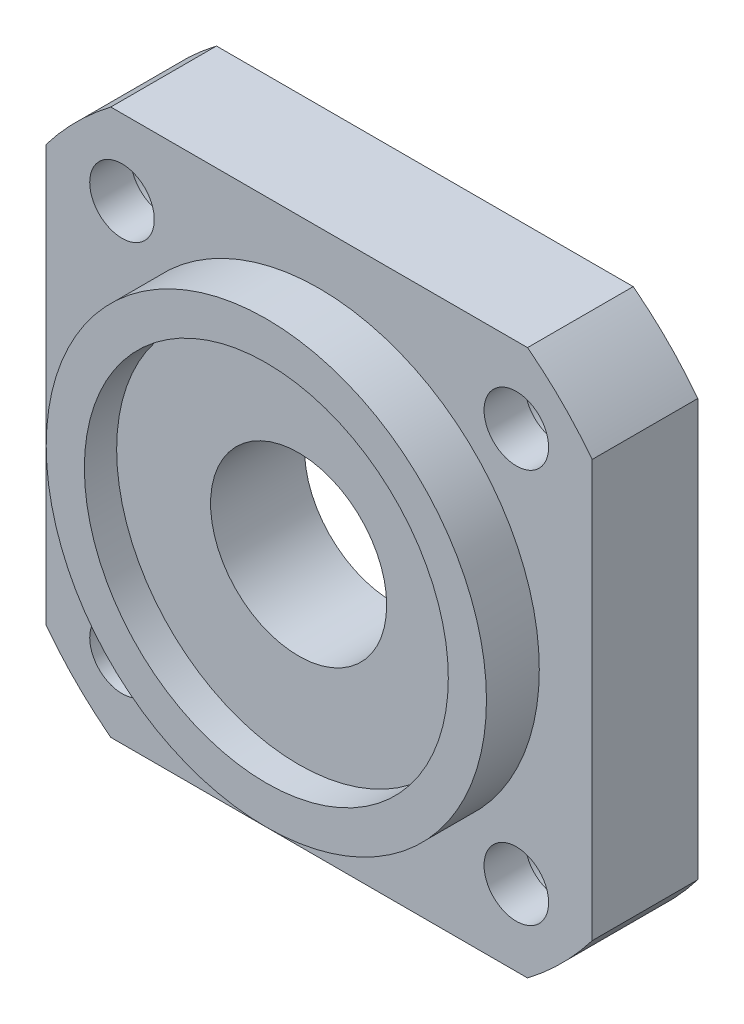
ISO-10303-21;
HEADER;
FILE_DESCRIPTION(('STEP AP214'),'2;1');
FILE_NAME('part.step','',(''),(''),'','','');
FILE_SCHEMA(('AUTOMOTIVE_DESIGN { 1 0 10303 214 1 1 1 1 }'));
ENDSEC;
DATA;
#1=APPLICATION_CONTEXT('core data for automotive mechanical design processes');
#2=APPLICATION_PROTOCOL_DEFINITION('international standard','automotive_design',2000,#1);
#3=PRODUCT_CONTEXT('',#1,'mechanical');
#4=PRODUCT('Part','Part','',(#3));
#5=PRODUCT_RELATED_PRODUCT_CATEGORY('part','',(#4));
#6=PRODUCT_DEFINITION_FORMATION('','',#4);
#7=PRODUCT_DEFINITION_CONTEXT('part definition',#1,'design');
#8=PRODUCT_DEFINITION('design','',#6,#7);
#9=PRODUCT_DEFINITION_SHAPE('','',#8);
#10=(LENGTH_UNIT() NAMED_UNIT(*) SI_UNIT(.MILLI.,.METRE.));
#11=(NAMED_UNIT(*) PLANE_ANGLE_UNIT() SI_UNIT($,.RADIAN.));
#12=(NAMED_UNIT(*) SI_UNIT($,.STERADIAN.) SOLID_ANGLE_UNIT());
#13=UNCERTAINTY_MEASURE_WITH_UNIT(LENGTH_MEASURE(1.E-05),#10,'distance_accuracy_value','');
#14=(GEOMETRIC_REPRESENTATION_CONTEXT(3) GLOBAL_UNCERTAINTY_ASSIGNED_CONTEXT((#13)) GLOBAL_UNIT_ASSIGNED_CONTEXT((#10,
#11,#12)) REPRESENTATION_CONTEXT('',''));
#15=CARTESIAN_POINT('',(0.,0.,0.));
#16=DIRECTION('',(0.,0.,1.));
#17=DIRECTION('',(1.,0.,0.));
#18=AXIS2_PLACEMENT_3D('',#15,#16,#17);
#19=CARTESIAN_POINT('',(0.,0.,0.));
#20=DIRECTION('',(0.,0.,1.));
#21=DIRECTION('',(1.,0.,0.));
#22=AXIS2_PLACEMENT_3D('',#19,#20,#21);
#23=PLANE('',#22);
#24=DIRECTION('',(0.,-1.,0.));
#25=VECTOR('',#24,1.);
#26=CARTESIAN_POINT('',(-46.5,35.4964786985977,0.));
#27=LINE('',#26,#25);
#28=CARTESIAN_POINT('',(-46.5,35.4964786985977,0.));
#29=VERTEX_POINT('',#28);
#30=CARTESIAN_POINT('',(-46.5,-35.4964786985977,0.));
#31=VERTEX_POINT('',#30);
#32=EDGE_CURVE('E58',#29,#31,#27,.T.);
#33=ORIENTED_EDGE('',*,*,#32,.F.);
#34=CARTESIAN_POINT('',(0.,0.,0.));
#35=DIRECTION('',(0.,0.,1.));
#36=DIRECTION('',(-0.606777413651243,0.794871794871795,0.));
#37=AXIS2_PLACEMENT_3D('',#34,#35,#36);
#38=CIRCLE('',#37,58.5);
#39=CARTESIAN_POINT('',(-35.4964786985977,46.5,0.));
#40=VERTEX_POINT('',#39);
#41=EDGE_CURVE('E152',#40,#29,#38,.T.);
#42=ORIENTED_EDGE('',*,*,#41,.F.);
#43=DIRECTION('',(-1.,0.,0.));
#44=VECTOR('',#43,1.);
#45=CARTESIAN_POINT('',(35.4964786985977,46.5,0.));
#46=LINE('',#45,#44);
#47=CARTESIAN_POINT('',(35.4964786985977,46.5,0.));
#48=VERTEX_POINT('',#47);
#49=EDGE_CURVE('E134',#48,#40,#46,.T.);
#50=ORIENTED_EDGE('',*,*,#49,.F.);
#51=CARTESIAN_POINT('',(0.,0.,0.));
#52=DIRECTION('',(0.,0.,1.));
#53=DIRECTION('',(0.794871794871795,0.606777413651243,0.));
#54=AXIS2_PLACEMENT_3D('',#51,#52,#53);
#55=CIRCLE('',#54,58.5);
#56=CARTESIAN_POINT('',(46.5,35.4964786985977,0.));
#57=VERTEX_POINT('',#56);
#58=EDGE_CURVE('E194',#57,#48,#55,.T.);
#59=ORIENTED_EDGE('',*,*,#58,.F.);
#60=DIRECTION('',(0.,1.,0.));
#61=VECTOR('',#60,1.);
#62=CARTESIAN_POINT('',(46.5,-35.4964786985977,0.));
#63=LINE('',#62,#61);
#64=CARTESIAN_POINT('',(46.5,-35.4964786985977,0.));
#65=VERTEX_POINT('',#64);
#66=EDGE_CURVE('E183',#65,#57,#63,.T.);
#67=ORIENTED_EDGE('',*,*,#66,.F.);
#68=CARTESIAN_POINT('',(0.,0.,0.));
#69=DIRECTION('',(0.,0.,1.));
#70=DIRECTION('',(0.606777413651243,-0.794871794871795,0.));
#71=AXIS2_PLACEMENT_3D('',#68,#69,#70);
#72=CIRCLE('',#71,58.5);
#73=CARTESIAN_POINT('',(35.4964786985977,-46.5,0.));
#74=VERTEX_POINT('',#73);
#75=EDGE_CURVE('E642',#74,#65,#72,.T.);
#76=ORIENTED_EDGE('',*,*,#75,.F.);
#77=DIRECTION('',(1.,0.,0.));
#78=VECTOR('',#77,1.);
#79=CARTESIAN_POINT('',(-35.4964786985977,-46.5,0.));
#80=LINE('',#79,#78);
#81=CARTESIAN_POINT('',(-35.4964786985977,-46.5,0.));
#82=VERTEX_POINT('',#81);
#83=EDGE_CURVE('E210',#82,#74,#80,.T.);
#84=ORIENTED_EDGE('',*,*,#83,.F.);
#85=CARTESIAN_POINT('',(0.,0.,0.));
#86=DIRECTION('',(0.,0.,1.));
#87=DIRECTION('',(-0.794871794871795,-0.606777413651243,0.));
#88=AXIS2_PLACEMENT_3D('',#85,#86,#87);
#89=CIRCLE('',#88,58.5);
#90=EDGE_CURVE('E221',#31,#82,#89,.T.);
#91=ORIENTED_EDGE('',*,*,#90,.F.);
#92=EDGE_LOOP('',(#33,#42,#50,#59,#67,#76,#84,#91));
#93=FACE_BOUND('',#92,.T.);
#94=CARTESIAN_POINT('',(-33.587572106361,33.587572106361,0.));
#95=DIRECTION('',(0.,0.,1.));
#96=DIRECTION('',(-1.,0.,0.));
#97=AXIS2_PLACEMENT_3D('',#94,#95,#96);
#98=CIRCLE('',#97,8.5);
#99=CARTESIAN_POINT('',(-42.087572106361,33.587572106361,0.));
#100=VERTEX_POINT('',#99);
#101=EDGE_CURVE('E175',#100,#100,#98,.T.);
#102=ORIENTED_EDGE('',*,*,#101,.T.);
#103=EDGE_LOOP('',(#102));
#104=FACE_BOUND('',#103,.T.);
#105=CARTESIAN_POINT('',(33.587572106361,-33.587572106361,0.));
#106=DIRECTION('',(0.,0.,1.));
#107=DIRECTION('',(-1.,0.,0.));
#108=AXIS2_PLACEMENT_3D('',#105,#106,#107);
#109=CIRCLE('',#108,8.5);
#110=CARTESIAN_POINT('',(25.087572106361,-33.587572106361,0.));
#111=VERTEX_POINT('',#110);
#112=EDGE_CURVE('E638',#111,#111,#109,.T.);
#113=ORIENTED_EDGE('',*,*,#112,.T.);
#114=EDGE_LOOP('',(#113));
#115=FACE_BOUND('',#114,.T.);
#116=CARTESIAN_POINT('',(33.587572106361,33.587572106361,0.));
#117=DIRECTION('',(0.,0.,1.));
#118=DIRECTION('',(-1.,0.,0.));
#119=AXIS2_PLACEMENT_3D('',#116,#117,#118);
#120=CIRCLE('',#119,8.5);
#121=CARTESIAN_POINT('',(25.087572106361,33.587572106361,0.));
#122=VERTEX_POINT('',#121);
#123=EDGE_CURVE('E631',#122,#122,#120,.T.);
#124=ORIENTED_EDGE('',*,*,#123,.T.);
#125=EDGE_LOOP('',(#124));
#126=FACE_BOUND('',#125,.T.);
#127=CARTESIAN_POINT('',(-33.587572106361,-33.587572106361,0.));
#128=DIRECTION('',(0.,0.,1.));
#129=DIRECTION('',(-1.,0.,0.));
#130=AXIS2_PLACEMENT_3D('',#127,#128,#129);
#131=CIRCLE('',#130,8.5);
#132=CARTESIAN_POINT('',(-42.087572106361,-33.587572106361,0.));
#133=VERTEX_POINT('',#132);
#134=EDGE_CURVE('E586',#133,#133,#131,.T.);
#135=ORIENTED_EDGE('',*,*,#134,.T.);
#136=EDGE_LOOP('',(#135));
#137=FACE_BOUND('',#136,.T.);
#138=CARTESIAN_POINT('',(0.,0.,0.));
#139=DIRECTION('',(0.,0.,1.));
#140=DIRECTION('',(1.,0.,0.));
#141=AXIS2_PLACEMENT_3D('',#138,#139,#140);
#142=CIRCLE('',#141,31.);
#143=CARTESIAN_POINT('',(31.,0.,0.));
#144=VERTEX_POINT('',#143);
#145=EDGE_CURVE('E607',#144,#144,#142,.T.);
#146=ORIENTED_EDGE('',*,*,#145,.T.);
#147=EDGE_LOOP('',(#146));
#148=FACE_BOUND('',#147,.T.);
#149=ADVANCED_FACE('F49',(#93,#104,#115,#126,#137,#148),#23,.F.);
#150=CARTESIAN_POINT('',(0.,0.,18.));
#151=DIRECTION('',(0.,0.,1.));
#152=DIRECTION('',(1.,0.,0.));
#153=AXIS2_PLACEMENT_3D('',#150,#151,#152);
#154=PLANE('',#153);
#155=DIRECTION('',(0.,-1.,0.));
#156=VECTOR('',#155,1.);
#157=CARTESIAN_POINT('',(-46.5,35.4964786985977,18.));
#158=LINE('',#157,#156);
#159=CARTESIAN_POINT('',(-46.5,35.4964786985977,18.));
#160=VERTEX_POINT('',#159);
#161=CARTESIAN_POINT('',(-46.5,-35.4964786985977,18.));
#162=VERTEX_POINT('',#161);
#163=EDGE_CURVE('E11',#160,#162,#158,.T.);
#164=ORIENTED_EDGE('',*,*,#163,.T.);
#165=CARTESIAN_POINT('',(0.,0.,18.));
#166=DIRECTION('',(0.,0.,1.));
#167=DIRECTION('',(-0.794871794871795,-0.606777413651243,0.));
#168=AXIS2_PLACEMENT_3D('',#165,#166,#167);
#169=CIRCLE('',#168,58.5);
#170=CARTESIAN_POINT('',(-35.4964786985977,-46.5,18.));
#171=VERTEX_POINT('',#170);
#172=EDGE_CURVE('E224',#162,#171,#169,.T.);
#173=ORIENTED_EDGE('',*,*,#172,.T.);
#174=DIRECTION('',(1.,0.,0.));
#175=VECTOR('',#174,1.);
#176=CARTESIAN_POINT('',(-35.4964786985977,-46.5,18.));
#177=LINE('',#176,#175);
#178=CARTESIAN_POINT('',(35.4964786985977,-46.5,18.));
#179=VERTEX_POINT('',#178);
#180=EDGE_CURVE('E214',#171,#179,#177,.T.);
#181=ORIENTED_EDGE('',*,*,#180,.T.);
#182=CARTESIAN_POINT('',(0.,0.,18.));
#183=DIRECTION('',(0.,0.,1.));
#184=DIRECTION('',(0.606777413651243,-0.794871794871795,0.));
#185=AXIS2_PLACEMENT_3D('',#182,#183,#184);
#186=CIRCLE('',#185,58.5);
#187=CARTESIAN_POINT('',(46.5,-35.4964786985977,18.));
#188=VERTEX_POINT('',#187);
#189=EDGE_CURVE('E211',#179,#188,#186,.T.);
#190=ORIENTED_EDGE('',*,*,#189,.T.);
#191=DIRECTION('',(0.,1.,0.));
#192=VECTOR('',#191,1.);
#193=CARTESIAN_POINT('',(46.5,-35.4964786985977,18.));
#194=LINE('',#193,#192);
#195=CARTESIAN_POINT('',(46.5,35.4964786985977,18.));
#196=VERTEX_POINT('',#195);
#197=EDGE_CURVE('E179',#188,#196,#194,.T.);
#198=ORIENTED_EDGE('',*,*,#197,.T.);
#199=CARTESIAN_POINT('',(0.,0.,18.));
#200=DIRECTION('',(0.,0.,1.));
#201=DIRECTION('',(0.794871794871795,0.606777413651243,0.));
#202=AXIS2_PLACEMENT_3D('',#199,#200,#201);
#203=CIRCLE('',#202,58.5);
#204=CARTESIAN_POINT('',(35.4964786985977,46.5,18.));
#205=VERTEX_POINT('',#204);
#206=EDGE_CURVE('E197',#196,#205,#203,.T.);
#207=ORIENTED_EDGE('',*,*,#206,.T.);
#208=DIRECTION('',(-1.,0.,0.));
#209=VECTOR('',#208,1.);
#210=CARTESIAN_POINT('',(35.4964786985977,46.5,18.));
#211=LINE('',#210,#209);
#212=CARTESIAN_POINT('',(-35.4964786985977,46.5,18.));
#213=VERTEX_POINT('',#212);
#214=EDGE_CURVE('E146',#205,#213,#211,.T.);
#215=ORIENTED_EDGE('',*,*,#214,.T.);
#216=CARTESIAN_POINT('',(0.,0.,18.));
#217=DIRECTION('',(0.,0.,1.));
#218=DIRECTION('',(-0.606777413651243,0.794871794871795,0.));
#219=AXIS2_PLACEMENT_3D('',#216,#217,#218);
#220=CIRCLE('',#219,58.5);
#221=EDGE_CURVE('E153',#213,#160,#220,.T.);
#222=ORIENTED_EDGE('',*,*,#221,.T.);
#223=EDGE_LOOP('',(#164,#173,#181,#190,#198,#207,#215,#222));
#224=FACE_BOUND('',#223,.T.);
#225=CARTESIAN_POINT('',(0.,0.,18.));
#226=DIRECTION('',(0.,0.,-1.));
#227=DIRECTION('',(-1.,0.,0.));
#228=AXIS2_PLACEMENT_3D('',#225,#226,#227);
#229=CIRCLE('',#228,37.5);
#230=CARTESIAN_POINT('',(-37.5,0.,18.));
#231=VERTEX_POINT('',#230);
#232=EDGE_CURVE('E160',#231,#231,#229,.T.);
#233=ORIENTED_EDGE('',*,*,#232,.T.);
#234=EDGE_LOOP('',(#233));
#235=FACE_BOUND('',#234,.T.);
#236=CARTESIAN_POINT('',(-33.587572106361,33.587572106361,18.));
#237=DIRECTION('',(0.,0.,-1.));
#238=DIRECTION('',(-1.,0.,0.));
#239=AXIS2_PLACEMENT_3D('',#236,#237,#238);
#240=CIRCLE('',#239,5.5);
#241=CARTESIAN_POINT('',(-39.087572106361,33.587572106361,18.));
#242=VERTEX_POINT('',#241);
#243=EDGE_CURVE('E178',#242,#242,#240,.T.);
#244=ORIENTED_EDGE('',*,*,#243,.T.);
#245=EDGE_LOOP('',(#244));
#246=FACE_BOUND('',#245,.T.);
#247=CARTESIAN_POINT('',(33.587572106361,-33.587572106361,18.));
#248=DIRECTION('',(0.,0.,-1.));
#249=DIRECTION('',(-1.,0.,0.));
#250=AXIS2_PLACEMENT_3D('',#247,#248,#249);
#251=CIRCLE('',#250,5.5);
#252=CARTESIAN_POINT('',(28.087572106361,-33.587572106361,18.));
#253=VERTEX_POINT('',#252);
#254=EDGE_CURVE('E575',#253,#253,#251,.T.);
#255=ORIENTED_EDGE('',*,*,#254,.T.);
#256=EDGE_LOOP('',(#255));
#257=FACE_BOUND('',#256,.T.);
#258=CARTESIAN_POINT('',(33.587572106361,33.587572106361,18.));
#259=DIRECTION('',(0.,0.,-1.));
#260=DIRECTION('',(-1.,0.,0.));
#261=AXIS2_PLACEMENT_3D('',#258,#259,#260);
#262=CIRCLE('',#261,5.5);
#263=CARTESIAN_POINT('',(28.087572106361,33.587572106361,18.));
#264=VERTEX_POINT('',#263);
#265=EDGE_CURVE('E579',#264,#264,#262,.T.);
#266=ORIENTED_EDGE('',*,*,#265,.T.);
#267=EDGE_LOOP('',(#266));
#268=FACE_BOUND('',#267,.T.);
#269=CARTESIAN_POINT('',(-33.587572106361,-33.587572106361,18.));
#270=DIRECTION('',(0.,0.,-1.));
#271=DIRECTION('',(-1.,0.,0.));
#272=AXIS2_PLACEMENT_3D('',#269,#270,#271);
#273=CIRCLE('',#272,5.5);
#274=CARTESIAN_POINT('',(-39.087572106361,-33.587572106361,18.));
#275=VERTEX_POINT('',#274);
#276=EDGE_CURVE('E582',#275,#275,#273,.T.);
#277=ORIENTED_EDGE('',*,*,#276,.T.);
#278=EDGE_LOOP('',(#277));
#279=FACE_BOUND('',#278,.T.);
#280=ADVANCED_FACE('F51',(#224,#235,#246,#257,#268,#279),#154,.T.);
#281=CARTESIAN_POINT('',(-46.5,35.4964786985977,0.));
#282=DIRECTION('',(-1.,0.,0.));
#283=DIRECTION('',(0.,1.,0.));
#284=AXIS2_PLACEMENT_3D('',#281,#282,#283);
#285=PLANE('',#284);
#286=ORIENTED_EDGE('',*,*,#32,.T.);
#287=DIRECTION('',(0.,0.,1.));
#288=VECTOR('',#287,1.);
#289=CARTESIAN_POINT('',(-46.5,-35.4964786985977,0.));
#290=LINE('',#289,#288);
#291=EDGE_CURVE('E225',#31,#162,#290,.T.);
#292=ORIENTED_EDGE('',*,*,#291,.T.);
#293=ORIENTED_EDGE('',*,*,#163,.F.);
#294=DIRECTION('',(0.,0.,1.));
#295=VECTOR('',#294,1.);
#296=CARTESIAN_POINT('',(-46.5,35.4964786985977,0.));
#297=LINE('',#296,#295);
#298=EDGE_CURVE('E159',#29,#160,#297,.T.);
#299=ORIENTED_EDGE('',*,*,#298,.F.);
#300=EDGE_LOOP('',(#286,#292,#293,#299));
#301=FACE_BOUND('',#300,.T.);
#302=ADVANCED_FACE('F467',(#301),#285,.T.);
#303=CARTESIAN_POINT('',(0.,0.,0.));
#304=DIRECTION('',(0.,0.,1.));
#305=DIRECTION('',(-0.794871794871795,-0.606777413651243,0.));
#306=AXIS2_PLACEMENT_3D('',#303,#304,#305);
#307=CYLINDRICAL_SURFACE('',#306,58.5);
#308=ORIENTED_EDGE('',*,*,#90,.T.);
#309=DIRECTION('',(0.,0.,1.));
#310=VECTOR('',#309,1.);
#311=CARTESIAN_POINT('',(-35.4964786985977,-46.5,0.));
#312=LINE('',#311,#310);
#313=EDGE_CURVE('E217',#82,#171,#312,.T.);
#314=ORIENTED_EDGE('',*,*,#313,.T.);
#315=ORIENTED_EDGE('',*,*,#172,.F.);
#316=ORIENTED_EDGE('',*,*,#291,.F.);
#317=EDGE_LOOP('',(#308,#314,#315,#316));
#318=FACE_BOUND('',#317,.T.);
#319=ADVANCED_FACE('F458',(#318),#307,.T.);
#320=CARTESIAN_POINT('',(-35.4964786985977,-46.5,0.));
#321=DIRECTION('',(0.,-1.,0.));
#322=DIRECTION('',(0.,0.,-1.));
#323=AXIS2_PLACEMENT_3D('',#320,#321,#322);
#324=PLANE('',#323);
#325=ORIENTED_EDGE('',*,*,#83,.T.);
#326=DIRECTION('',(0.,0.,1.));
#327=VECTOR('',#326,1.);
#328=CARTESIAN_POINT('',(35.4964786985977,-46.5,0.));
#329=LINE('',#328,#327);
#330=EDGE_CURVE('E206',#74,#179,#329,.T.);
#331=ORIENTED_EDGE('',*,*,#330,.T.);
#332=ORIENTED_EDGE('',*,*,#180,.F.);
#333=ORIENTED_EDGE('',*,*,#313,.F.);
#334=EDGE_LOOP('',(#325,#331,#332,#333));
#335=FACE_BOUND('',#334,.T.);
#336=ADVANCED_FACE('F449',(#335),#324,.T.);
#337=CARTESIAN_POINT('',(0.,0.,0.));
#338=DIRECTION('',(0.,0.,1.));
#339=DIRECTION('',(0.606777413651243,-0.794871794871795,0.));
#340=AXIS2_PLACEMENT_3D('',#337,#338,#339);
#341=CYLINDRICAL_SURFACE('',#340,58.5);
#342=ORIENTED_EDGE('',*,*,#75,.T.);
#343=DIRECTION('',(0.,0.,1.));
#344=VECTOR('',#343,1.);
#345=CARTESIAN_POINT('',(46.5,-35.4964786985977,0.));
#346=LINE('',#345,#344);
#347=EDGE_CURVE('E182',#65,#188,#346,.T.);
#348=ORIENTED_EDGE('',*,*,#347,.T.);
#349=ORIENTED_EDGE('',*,*,#189,.F.);
#350=ORIENTED_EDGE('',*,*,#330,.F.);
#351=EDGE_LOOP('',(#342,#348,#349,#350));
#352=FACE_BOUND('',#351,.T.);
#353=ADVANCED_FACE('F432',(#352),#341,.T.);
#354=CARTESIAN_POINT('',(46.5,-35.4964786985977,0.));
#355=DIRECTION('',(1.,0.,0.));
#356=DIRECTION('',(0.,1.,0.));
#357=AXIS2_PLACEMENT_3D('',#354,#355,#356);
#358=PLANE('',#357);
#359=ORIENTED_EDGE('',*,*,#66,.T.);
#360=DIRECTION('',(0.,0.,1.));
#361=VECTOR('',#360,1.);
#362=CARTESIAN_POINT('',(46.5,35.4964786985977,0.));
#363=LINE('',#362,#361);
#364=EDGE_CURVE('E200',#57,#196,#363,.T.);
#365=ORIENTED_EDGE('',*,*,#364,.T.);
#366=ORIENTED_EDGE('',*,*,#197,.F.);
#367=ORIENTED_EDGE('',*,*,#347,.F.);
#368=EDGE_LOOP('',(#359,#365,#366,#367));
#369=FACE_BOUND('',#368,.T.);
#370=ADVANCED_FACE('F423',(#369),#358,.T.);
#371=CARTESIAN_POINT('',(0.,0.,0.));
#372=DIRECTION('',(0.,0.,1.));
#373=DIRECTION('',(0.794871794871795,0.606777413651243,0.));
#374=AXIS2_PLACEMENT_3D('',#371,#372,#373);
#375=CYLINDRICAL_SURFACE('',#374,58.5);
#376=ORIENTED_EDGE('',*,*,#58,.T.);
#377=DIRECTION('',(0.,0.,1.));
#378=VECTOR('',#377,1.);
#379=CARTESIAN_POINT('',(35.4964786985977,46.5,0.));
#380=LINE('',#379,#378);
#381=EDGE_CURVE('E141',#48,#205,#380,.T.);
#382=ORIENTED_EDGE('',*,*,#381,.T.);
#383=ORIENTED_EDGE('',*,*,#206,.F.);
#384=ORIENTED_EDGE('',*,*,#364,.F.);
#385=EDGE_LOOP('',(#376,#382,#383,#384));
#386=FACE_BOUND('',#385,.T.);
#387=ADVANCED_FACE('F415',(#386),#375,.T.);
#388=CARTESIAN_POINT('',(35.4964786985977,46.5,0.));
#389=DIRECTION('',(0.,1.,0.));
#390=DIRECTION('',(1.,0.,0.));
#391=AXIS2_PLACEMENT_3D('',#388,#389,#390);
#392=PLANE('',#391);
#393=ORIENTED_EDGE('',*,*,#49,.T.);
#394=DIRECTION('',(0.,0.,1.));
#395=VECTOR('',#394,1.);
#396=CARTESIAN_POINT('',(-35.4964786985977,46.5,0.));
#397=LINE('',#396,#395);
#398=EDGE_CURVE('E138',#40,#213,#397,.T.);
#399=ORIENTED_EDGE('',*,*,#398,.T.);
#400=ORIENTED_EDGE('',*,*,#214,.F.);
#401=ORIENTED_EDGE('',*,*,#381,.F.);
#402=EDGE_LOOP('',(#393,#399,#400,#401));
#403=FACE_BOUND('',#402,.T.);
#404=ADVANCED_FACE('F136',(#403),#392,.T.);
#405=CARTESIAN_POINT('',(0.,0.,0.));
#406=DIRECTION('',(0.,0.,1.));
#407=DIRECTION('',(-0.606777413651243,0.794871794871795,0.));
#408=AXIS2_PLACEMENT_3D('',#405,#406,#407);
#409=CYLINDRICAL_SURFACE('',#408,58.5);
#410=ORIENTED_EDGE('',*,*,#41,.T.);
#411=ORIENTED_EDGE('',*,*,#298,.T.);
#412=ORIENTED_EDGE('',*,*,#221,.F.);
#413=ORIENTED_EDGE('',*,*,#398,.F.);
#414=EDGE_LOOP('',(#410,#411,#412,#413));
#415=FACE_BOUND('',#414,.T.);
#416=ADVANCED_FACE('F150',(#415),#409,.T.);
#417=CARTESIAN_POINT('',(0.,0.,27.));
#418=DIRECTION('',(0.,0.,1.));
#419=DIRECTION('',(1.,0.,0.));
#420=AXIS2_PLACEMENT_3D('',#417,#418,#419);
#421=PLANE('',#420);
#422=CARTESIAN_POINT('',(0.,0.,27.));
#423=DIRECTION('',(0.,0.,1.));
#424=DIRECTION('',(-1.,0.,0.));
#425=AXIS2_PLACEMENT_3D('',#422,#423,#424);
#426=CIRCLE('',#425,37.5);
#427=CARTESIAN_POINT('',(-37.5,0.,27.));
#428=VERTEX_POINT('',#427);
#429=EDGE_CURVE('E169',#428,#428,#426,.T.);
#430=ORIENTED_EDGE('',*,*,#429,.T.);
#431=EDGE_LOOP('',(#430));
#432=FACE_BOUND('',#431,.T.);
#433=CARTESIAN_POINT('',(0.,0.,27.));
#434=DIRECTION('',(0.,0.,-1.));
#435=DIRECTION('',(-1.,0.,0.));
#436=AXIS2_PLACEMENT_3D('',#433,#434,#435);
#437=CIRCLE('',#436,31.);
#438=CARTESIAN_POINT('',(-31.,0.,27.));
#439=VERTEX_POINT('',#438);
#440=EDGE_CURVE('E608',#439,#439,#437,.T.);
#441=ORIENTED_EDGE('',*,*,#440,.T.);
#442=EDGE_LOOP('',(#441));
#443=FACE_BOUND('',#442,.T.);
#444=ADVANCED_FACE('F238',(#432,#443),#421,.T.);
#445=CARTESIAN_POINT('',(0.,0.,18.));
#446=DIRECTION('',(0.,0.,1.));
#447=DIRECTION('',(-1.,0.,0.));
#448=AXIS2_PLACEMENT_3D('',#445,#446,#447);
#449=CYLINDRICAL_SURFACE('',#448,37.5);
#450=ORIENTED_EDGE('',*,*,#232,.F.);
#451=EDGE_LOOP('',(#450));
#452=FACE_BOUND('',#451,.T.);
#453=ORIENTED_EDGE('',*,*,#429,.F.);
#454=EDGE_LOOP('',(#453));
#455=FACE_BOUND('',#454,.T.);
#456=ADVANCED_FACE('F232',(#452,#455),#449,.T.);
#457=CARTESIAN_POINT('',(-33.587572106361,33.587572106361,134.264664003601));
#458=DIRECTION('',(0.,0.,-1.));
#459=DIRECTION('',(-1.,0.,0.));
#460=AXIS2_PLACEMENT_3D('',#457,#458,#459);
#461=CYLINDRICAL_SURFACE('',#460,5.5);
#462=CARTESIAN_POINT('',(-33.587572106361,33.587572106361,11.));
#463=DIRECTION('',(0.,0.,-1.));
#464=DIRECTION('',(-1.,0.,0.));
#465=AXIS2_PLACEMENT_3D('',#462,#463,#464);
#466=CIRCLE('',#465,5.5);
#467=CARTESIAN_POINT('',(-39.087572106361,33.587572106361,11.));
#468=VERTEX_POINT('',#467);
#469=EDGE_CURVE('E173',#468,#468,#466,.T.);
#470=ORIENTED_EDGE('',*,*,#469,.T.);
#471=EDGE_LOOP('',(#470));
#472=FACE_BOUND('',#471,.T.);
#473=ORIENTED_EDGE('',*,*,#243,.F.);
#474=EDGE_LOOP('',(#473));
#475=FACE_BOUND('',#474,.T.);
#476=ADVANCED_FACE('F237',(#472,#475),#461,.F.);
#477=CARTESIAN_POINT('',(-33.587572106361,33.587572106361,5.5));
#478=DIRECTION('',(0.,0.,-1.));
#479=DIRECTION('',(-1.,0.,0.));
#480=AXIS2_PLACEMENT_3D('',#477,#478,#479);
#481=CYLINDRICAL_SURFACE('',#480,8.5);
#482=CARTESIAN_POINT('',(-33.587572106361,33.587572106361,11.));
#483=DIRECTION('',(0.,0.,-1.));
#484=DIRECTION('',(-1.,0.,0.));
#485=AXIS2_PLACEMENT_3D('',#482,#483,#484);
#486=CIRCLE('',#485,8.5);
#487=CARTESIAN_POINT('',(-42.087572106361,33.587572106361,11.));
#488=VERTEX_POINT('',#487);
#489=EDGE_CURVE('E659',#488,#488,#486,.T.);
#490=ORIENTED_EDGE('',*,*,#489,.F.);
#491=EDGE_LOOP('',(#490));
#492=FACE_BOUND('',#491,.T.);
#493=ORIENTED_EDGE('',*,*,#101,.F.);
#494=EDGE_LOOP('',(#493));
#495=FACE_BOUND('',#494,.T.);
#496=ADVANCED_FACE('F333',(#492,#495),#481,.F.);
#497=CARTESIAN_POINT('',(-33.587572106361,33.587572106361,11.));
#498=DIRECTION('',(0.,0.,-1.));
#499=DIRECTION('',(0.,-1.,0.));
#500=AXIS2_PLACEMENT_3D('',#497,#498,#499);
#501=PLANE('',#500);
#502=ORIENTED_EDGE('',*,*,#469,.F.);
#503=EDGE_LOOP('',(#502));
#504=FACE_BOUND('',#503,.T.);
#505=ORIENTED_EDGE('',*,*,#489,.T.);
#506=EDGE_LOOP('',(#505));
#507=FACE_BOUND('',#506,.T.);
#508=ADVANCED_FACE('F338',(#504,#507),#501,.T.);
#509=CARTESIAN_POINT('',(33.587572106361,-33.587572106361,134.264664003601));
#510=DIRECTION('',(0.,0.,-1.));
#511=DIRECTION('',(-1.,0.,0.));
#512=AXIS2_PLACEMENT_3D('',#509,#510,#511);
#513=CYLINDRICAL_SURFACE('',#512,5.5);
#514=CARTESIAN_POINT('',(33.587572106361,-33.587572106361,11.));
#515=DIRECTION('',(0.,0.,-1.));
#516=DIRECTION('',(-1.,0.,0.));
#517=AXIS2_PLACEMENT_3D('',#514,#515,#516);
#518=CIRCLE('',#517,5.5);
#519=CARTESIAN_POINT('',(28.087572106361,-33.587572106361,11.));
#520=VERTEX_POINT('',#519);
#521=EDGE_CURVE('E635',#520,#520,#518,.T.);
#522=ORIENTED_EDGE('',*,*,#521,.T.);
#523=EDGE_LOOP('',(#522));
#524=FACE_BOUND('',#523,.T.);
#525=ORIENTED_EDGE('',*,*,#254,.F.);
#526=EDGE_LOOP('',(#525));
#527=FACE_BOUND('',#526,.T.);
#528=ADVANCED_FACE('F347',(#524,#527),#513,.F.);
#529=CARTESIAN_POINT('',(33.587572106361,-33.587572106361,5.5));
#530=DIRECTION('',(0.,0.,-1.));
#531=DIRECTION('',(-1.,0.,0.));
#532=AXIS2_PLACEMENT_3D('',#529,#530,#531);
#533=CYLINDRICAL_SURFACE('',#532,8.5);
#534=CARTESIAN_POINT('',(33.587572106361,-33.587572106361,11.));
#535=DIRECTION('',(0.,0.,-1.));
#536=DIRECTION('',(-1.,0.,0.));
#537=AXIS2_PLACEMENT_3D('',#534,#535,#536);
#538=CIRCLE('',#537,8.5);
#539=CARTESIAN_POINT('',(25.087572106361,-33.587572106361,11.));
#540=VERTEX_POINT('',#539);
#541=EDGE_CURVE('E630',#540,#540,#538,.T.);
#542=ORIENTED_EDGE('',*,*,#541,.F.);
#543=EDGE_LOOP('',(#542));
#544=FACE_BOUND('',#543,.T.);
#545=ORIENTED_EDGE('',*,*,#112,.F.);
#546=EDGE_LOOP('',(#545));
#547=FACE_BOUND('',#546,.T.);
#548=ADVANCED_FACE('F360',(#544,#547),#533,.F.);
#549=CARTESIAN_POINT('',(33.587572106361,-33.587572106361,11.));
#550=DIRECTION('',(0.,0.,-1.));
#551=DIRECTION('',(0.,-1.,0.));
#552=AXIS2_PLACEMENT_3D('',#549,#550,#551);
#553=PLANE('',#552);
#554=ORIENTED_EDGE('',*,*,#521,.F.);
#555=EDGE_LOOP('',(#554));
#556=FACE_BOUND('',#555,.T.);
#557=ORIENTED_EDGE('',*,*,#541,.T.);
#558=EDGE_LOOP('',(#557));
#559=FACE_BOUND('',#558,.T.);
#560=ADVANCED_FACE('F299',(#556,#559),#553,.T.);
#561=CARTESIAN_POINT('',(33.587572106361,33.587572106361,134.264664003601));
#562=DIRECTION('',(0.,0.,-1.));
#563=DIRECTION('',(-1.,0.,0.));
#564=AXIS2_PLACEMENT_3D('',#561,#562,#563);
#565=CYLINDRICAL_SURFACE('',#564,5.5);
#566=CARTESIAN_POINT('',(33.587572106361,33.587572106361,11.));
#567=DIRECTION('',(0.,0.,-1.));
#568=DIRECTION('',(-1.,0.,0.));
#569=AXIS2_PLACEMENT_3D('',#566,#567,#568);
#570=CIRCLE('',#569,5.5);
#571=CARTESIAN_POINT('',(28.087572106361,33.587572106361,11.));
#572=VERTEX_POINT('',#571);
#573=EDGE_CURVE('E593',#572,#572,#570,.T.);
#574=ORIENTED_EDGE('',*,*,#573,.T.);
#575=EDGE_LOOP('',(#574));
#576=FACE_BOUND('',#575,.T.);
#577=ORIENTED_EDGE('',*,*,#265,.F.);
#578=EDGE_LOOP('',(#577));
#579=FACE_BOUND('',#578,.T.);
#580=ADVANCED_FACE('F293',(#576,#579),#565,.F.);
#581=CARTESIAN_POINT('',(33.587572106361,33.587572106361,5.5));
#582=DIRECTION('',(0.,0.,-1.));
#583=DIRECTION('',(-1.,0.,0.));
#584=AXIS2_PLACEMENT_3D('',#581,#582,#583);
#585=CYLINDRICAL_SURFACE('',#584,8.5);
#586=CARTESIAN_POINT('',(33.587572106361,33.587572106361,11.));
#587=DIRECTION('',(0.,0.,-1.));
#588=DIRECTION('',(-1.,0.,0.));
#589=AXIS2_PLACEMENT_3D('',#586,#587,#588);
#590=CIRCLE('',#589,8.5);
#591=CARTESIAN_POINT('',(25.087572106361,33.587572106361,11.));
#592=VERTEX_POINT('',#591);
#593=EDGE_CURVE('E585',#592,#592,#590,.T.);
#594=ORIENTED_EDGE('',*,*,#593,.F.);
#595=EDGE_LOOP('',(#594));
#596=FACE_BOUND('',#595,.T.);
#597=ORIENTED_EDGE('',*,*,#123,.F.);
#598=EDGE_LOOP('',(#597));
#599=FACE_BOUND('',#598,.T.);
#600=ADVANCED_FACE('F298',(#596,#599),#585,.F.);
#601=CARTESIAN_POINT('',(33.587572106361,33.587572106361,11.));
#602=DIRECTION('',(0.,0.,-1.));
#603=DIRECTION('',(0.,-1.,0.));
#604=AXIS2_PLACEMENT_3D('',#601,#602,#603);
#605=PLANE('',#604);
#606=ORIENTED_EDGE('',*,*,#573,.F.);
#607=EDGE_LOOP('',(#606));
#608=FACE_BOUND('',#607,.T.);
#609=ORIENTED_EDGE('',*,*,#593,.T.);
#610=EDGE_LOOP('',(#609));
#611=FACE_BOUND('',#610,.T.);
#612=ADVANCED_FACE('F327',(#608,#611),#605,.T.);
#613=CARTESIAN_POINT('',(-33.587572106361,-33.587572106361,134.264664003601));
#614=DIRECTION('',(0.,0.,-1.));
#615=DIRECTION('',(-1.,0.,0.));
#616=AXIS2_PLACEMENT_3D('',#613,#614,#615);
#617=CYLINDRICAL_SURFACE('',#616,5.5);
#618=CARTESIAN_POINT('',(-33.587572106361,-33.587572106361,11.));
#619=DIRECTION('',(0.,0.,-1.));
#620=DIRECTION('',(-1.,0.,0.));
#621=AXIS2_PLACEMENT_3D('',#618,#619,#620);
#622=CIRCLE('',#621,5.5);
#623=CARTESIAN_POINT('',(-39.087572106361,-33.587572106361,11.));
#624=VERTEX_POINT('',#623);
#625=EDGE_CURVE('E597',#624,#624,#622,.T.);
#626=ORIENTED_EDGE('',*,*,#625,.T.);
#627=EDGE_LOOP('',(#626));
#628=FACE_BOUND('',#627,.T.);
#629=ORIENTED_EDGE('',*,*,#276,.F.);
#630=EDGE_LOOP('',(#629));
#631=FACE_BOUND('',#630,.T.);
#632=ADVANCED_FACE('F318',(#628,#631),#617,.F.);
#633=CARTESIAN_POINT('',(-33.587572106361,-33.587572106361,5.5));
#634=DIRECTION('',(0.,0.,-1.));
#635=DIRECTION('',(-1.,0.,0.));
#636=AXIS2_PLACEMENT_3D('',#633,#634,#635);
#637=CYLINDRICAL_SURFACE('',#636,8.5);
#638=CARTESIAN_POINT('',(-33.587572106361,-33.587572106361,11.));
#639=DIRECTION('',(0.,0.,-1.));
#640=DIRECTION('',(-1.,0.,0.));
#641=AXIS2_PLACEMENT_3D('',#638,#639,#640);
#642=CIRCLE('',#641,8.5);
#643=CARTESIAN_POINT('',(-42.087572106361,-33.587572106361,11.));
#644=VERTEX_POINT('',#643);
#645=EDGE_CURVE('E615',#644,#644,#642,.T.);
#646=ORIENTED_EDGE('',*,*,#645,.F.);
#647=EDGE_LOOP('',(#646));
#648=FACE_BOUND('',#647,.T.);
#649=ORIENTED_EDGE('',*,*,#134,.F.);
#650=EDGE_LOOP('',(#649));
#651=FACE_BOUND('',#650,.T.);
#652=ADVANCED_FACE('F309',(#648,#651),#637,.F.);
#653=CARTESIAN_POINT('',(-33.587572106361,-33.587572106361,11.));
#654=DIRECTION('',(0.,0.,-1.));
#655=DIRECTION('',(0.,-1.,0.));
#656=AXIS2_PLACEMENT_3D('',#653,#654,#655);
#657=PLANE('',#656);
#658=ORIENTED_EDGE('',*,*,#625,.F.);
#659=EDGE_LOOP('',(#658));
#660=FACE_BOUND('',#659,.T.);
#661=ORIENTED_EDGE('',*,*,#645,.T.);
#662=EDGE_LOOP('',(#661));
#663=FACE_BOUND('',#662,.T.);
#664=ADVANCED_FACE('F287',(#660,#663),#657,.T.);
#665=CARTESIAN_POINT('',(0.,0.,5.5));
#666=DIRECTION('',(0.,0.,1.));
#667=DIRECTION('',(1.,0.,0.));
#668=AXIS2_PLACEMENT_3D('',#665,#666,#667);
#669=PLANE('',#668);
#670=CARTESIAN_POINT('',(0.,0.,5.5));
#671=DIRECTION('',(0.,0.,1.));
#672=DIRECTION('',(1.,0.,0.));
#673=AXIS2_PLACEMENT_3D('',#670,#671,#672);
#674=CIRCLE('',#673,31.);
#675=CARTESIAN_POINT('',(31.,0.,5.5));
#676=VERTEX_POINT('',#675);
#677=EDGE_CURVE('E603',#676,#676,#674,.T.);
#678=ORIENTED_EDGE('',*,*,#677,.F.);
#679=EDGE_LOOP('',(#678));
#680=FACE_BOUND('',#679,.T.);
#681=CARTESIAN_POINT('',(0.,0.,5.5));
#682=DIRECTION('',(0.,0.,1.));
#683=DIRECTION('',(1.,0.,0.));
#684=AXIS2_PLACEMENT_3D('',#681,#682,#683);
#685=CIRCLE('',#684,15.);
#686=CARTESIAN_POINT('',(15.,0.,5.5));
#687=VERTEX_POINT('',#686);
#688=EDGE_CURVE('E609',#687,#687,#685,.T.);
#689=ORIENTED_EDGE('',*,*,#688,.T.);
#690=EDGE_LOOP('',(#689));
#691=FACE_BOUND('',#690,.T.);
#692=ADVANCED_FACE('F278',(#680,#691),#669,.F.);
#693=CARTESIAN_POINT('',(0.,0.,0.));
#694=DIRECTION('',(0.,0.,1.));
#695=DIRECTION('',(1.,0.,0.));
#696=AXIS2_PLACEMENT_3D('',#693,#694,#695);
#697=CYLINDRICAL_SURFACE('',#696,31.);
#698=ORIENTED_EDGE('',*,*,#145,.F.);
#699=EDGE_LOOP('',(#698));
#700=FACE_BOUND('',#699,.T.);
#701=ORIENTED_EDGE('',*,*,#677,.T.);
#702=EDGE_LOOP('',(#701));
#703=FACE_BOUND('',#702,.T.);
#704=ADVANCED_FACE('F269',(#700,#703),#697,.F.);
#705=CARTESIAN_POINT('',(0.,0.,21.5));
#706=DIRECTION('',(0.,0.,1.));
#707=DIRECTION('',(1.,0.,0.));
#708=AXIS2_PLACEMENT_3D('',#705,#706,#707);
#709=PLANE('',#708);
#710=CARTESIAN_POINT('',(0.,0.,21.5));
#711=DIRECTION('',(0.,0.,-1.));
#712=DIRECTION('',(-1.,0.,0.));
#713=AXIS2_PLACEMENT_3D('',#710,#711,#712);
#714=CIRCLE('',#713,31.);
#715=CARTESIAN_POINT('',(-31.,0.,21.5));
#716=VERTEX_POINT('',#715);
#717=EDGE_CURVE('E613',#716,#716,#714,.T.);
#718=ORIENTED_EDGE('',*,*,#717,.F.);
#719=EDGE_LOOP('',(#718));
#720=FACE_BOUND('',#719,.T.);
#721=CARTESIAN_POINT('',(0.,0.,21.5));
#722=DIRECTION('',(0.,0.,-1.));
#723=DIRECTION('',(1.,0.,0.));
#724=AXIS2_PLACEMENT_3D('',#721,#722,#723);
#725=CIRCLE('',#724,15.);
#726=CARTESIAN_POINT('',(15.,0.,21.5));
#727=VERTEX_POINT('',#726);
#728=EDGE_CURVE('E614',#727,#727,#725,.T.);
#729=ORIENTED_EDGE('',*,*,#728,.T.);
#730=EDGE_LOOP('',(#729));
#731=FACE_BOUND('',#730,.T.);
#732=ADVANCED_FACE('F259',(#720,#731),#709,.T.);
#733=CARTESIAN_POINT('',(0.,0.,27.));
#734=DIRECTION('',(0.,0.,-1.));
#735=DIRECTION('',(-1.,0.,0.));
#736=AXIS2_PLACEMENT_3D('',#733,#734,#735);
#737=CYLINDRICAL_SURFACE('',#736,31.);
#738=ORIENTED_EDGE('',*,*,#440,.F.);
#739=EDGE_LOOP('',(#738));
#740=FACE_BOUND('',#739,.T.);
#741=ORIENTED_EDGE('',*,*,#717,.T.);
#742=EDGE_LOOP('',(#741));
#743=FACE_BOUND('',#742,.T.);
#744=ADVANCED_FACE('F250',(#740,#743),#737,.F.);
#745=CARTESIAN_POINT('',(0.,0.,5.5));
#746=DIRECTION('',(0.,0.,1.));
#747=DIRECTION('',(1.,0.,0.));
#748=AXIS2_PLACEMENT_3D('',#745,#746,#747);
#749=CYLINDRICAL_SURFACE('',#748,15.);
#750=ORIENTED_EDGE('',*,*,#688,.F.);
#751=EDGE_LOOP('',(#750));
#752=FACE_BOUND('',#751,.T.);
#753=ORIENTED_EDGE('',*,*,#728,.F.);
#754=EDGE_LOOP('',(#753));
#755=FACE_BOUND('',#754,.T.);
#756=ADVANCED_FACE('F245',(#752,#755),#749,.F.);
#757=CLOSED_SHELL('',(#149,#280,#302,#319,#336,#353,#370,#387,#404,#416,#444,#456,#476,#496,
#508,#528,#548,#560,#580,#600,#612,#632,#652,#664,#692,#704,#732,#744,#756));
#758=MANIFOLD_SOLID_BREP('B2',#757);
#759=ADVANCED_BREP_SHAPE_REPRESENTATION('',(#18,#758),#14);
#760=SHAPE_DEFINITION_REPRESENTATION(#9,#759);
ENDSEC;
END-ISO-10303-21;
